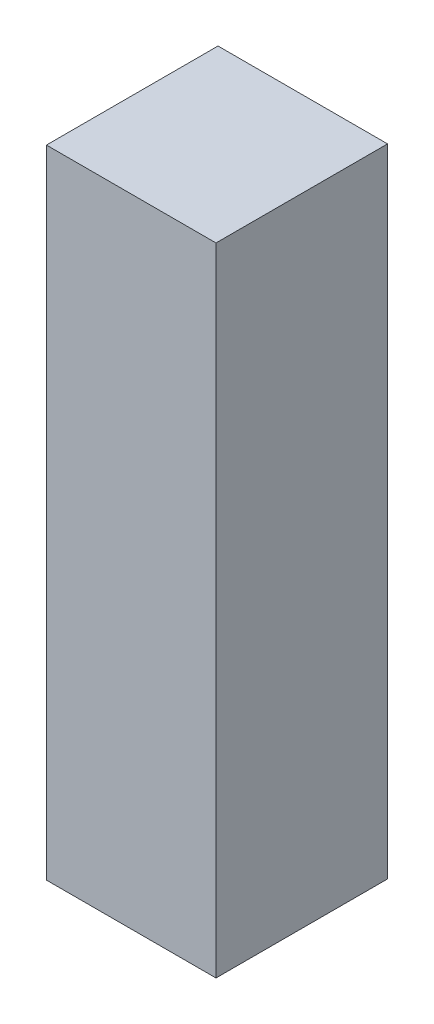
ISO-10303-21;
HEADER;
FILE_DESCRIPTION(('STEP AP214'),'2;1');
FILE_NAME('part.step','',(''),(''),'','','');
FILE_SCHEMA(('AUTOMOTIVE_DESIGN { 1 0 10303 214 1 1 1 1 }'));
ENDSEC;
DATA;
#1=APPLICATION_CONTEXT('core data for automotive mechanical design processes');
#2=APPLICATION_PROTOCOL_DEFINITION('international standard','automotive_design',2000,#1);
#3=PRODUCT_CONTEXT('',#1,'mechanical');
#4=PRODUCT('Part','Part','',(#3));
#5=PRODUCT_RELATED_PRODUCT_CATEGORY('part','',(#4));
#6=PRODUCT_DEFINITION_FORMATION('','',#4);
#7=PRODUCT_DEFINITION_CONTEXT('part definition',#1,'design');
#8=PRODUCT_DEFINITION('design','',#6,#7);
#9=PRODUCT_DEFINITION_SHAPE('','',#8);
#10=(LENGTH_UNIT() NAMED_UNIT(*) SI_UNIT(.MILLI.,.METRE.));
#11=(NAMED_UNIT(*) PLANE_ANGLE_UNIT() SI_UNIT($,.RADIAN.));
#12=(NAMED_UNIT(*) SI_UNIT($,.STERADIAN.) SOLID_ANGLE_UNIT());
#13=UNCERTAINTY_MEASURE_WITH_UNIT(LENGTH_MEASURE(1.E-05),#10,'distance_accuracy_value','');
#14=(GEOMETRIC_REPRESENTATION_CONTEXT(3) GLOBAL_UNCERTAINTY_ASSIGNED_CONTEXT((#13)) GLOBAL_UNIT_ASSIGNED_CONTEXT((#10,
#11,#12)) REPRESENTATION_CONTEXT('',''));
#15=CARTESIAN_POINT('',(0.,0.,0.));
#16=DIRECTION('',(0.,0.,1.));
#17=DIRECTION('',(1.,0.,0.));
#18=AXIS2_PLACEMENT_3D('',#15,#16,#17);
#19=CARTESIAN_POINT('',(10.16,43.556246407511,18.9405834941848));
#20=DIRECTION('',(0.,0.,-1.));
#21=DIRECTION('',(-1.,0.,0.));
#22=AXIS2_PLACEMENT_3D('',#19,#20,#21);
#23=PLANE('',#22);
#24=DIRECTION('',(0.,-1.,0.));
#25=VECTOR('',#24,1.);
#26=CARTESIAN_POINT('',(0.,43.556246407511,18.9405834941848));
#27=LINE('',#26,#25);
#28=CARTESIAN_POINT('',(0.,43.556246407511,18.9405834941848));
#29=VERTEX_POINT('',#28);
#30=CARTESIAN_POINT('',(0.,5.41071383944235,18.9405834941848));
#31=VERTEX_POINT('',#30);
#32=EDGE_CURVE('E95',#29,#31,#27,.T.);
#33=ORIENTED_EDGE('',*,*,#32,.T.);
#34=DIRECTION('',(-1.,0.,0.));
#35=VECTOR('',#34,1.);
#36=CARTESIAN_POINT('',(10.16,5.41071383944235,18.9405834941848));
#37=LINE('',#36,#35);
#38=CARTESIAN_POINT('',(10.16,5.41071383944235,18.9405834941848));
#39=VERTEX_POINT('',#38);
#40=EDGE_CURVE('E11',#39,#31,#37,.T.);
#41=ORIENTED_EDGE('',*,*,#40,.F.);
#42=DIRECTION('',(0.,-1.,0.));
#43=VECTOR('',#42,1.);
#44=CARTESIAN_POINT('',(10.16,43.556246407511,18.9405834941848));
#45=LINE('',#44,#43);
#46=CARTESIAN_POINT('',(10.16,43.556246407511,18.9405834941848));
#47=VERTEX_POINT('',#46);
#48=EDGE_CURVE('E83',#47,#39,#45,.T.);
#49=ORIENTED_EDGE('',*,*,#48,.F.);
#50=DIRECTION('',(-1.,0.,0.));
#51=VECTOR('',#50,1.);
#52=CARTESIAN_POINT('',(10.16,43.556246407511,18.9405834941848));
#53=LINE('',#52,#51);
#54=EDGE_CURVE('E91',#47,#29,#53,.T.);
#55=ORIENTED_EDGE('',*,*,#54,.T.);
#56=EDGE_LOOP('',(#33,#41,#49,#55));
#57=FACE_BOUND('',#56,.T.);
#58=ADVANCED_FACE('F32',(#57),#23,.F.);
#59=CARTESIAN_POINT('',(10.16,5.41071383944235,18.9405834941848));
#60=DIRECTION('',(0.,1.,0.));
#61=DIRECTION('',(0.,0.,1.));
#62=AXIS2_PLACEMENT_3D('',#59,#60,#61);
#63=PLANE('',#62);
#64=DIRECTION('',(0.,0.,-1.));
#65=VECTOR('',#64,1.);
#66=CARTESIAN_POINT('',(0.,5.41071383944235,18.9405834941848));
#67=LINE('',#66,#65);
#68=CARTESIAN_POINT('',(0.,5.41071383944235,8.66022719924431));
#69=VERTEX_POINT('',#68);
#70=EDGE_CURVE('E87',#31,#69,#67,.T.);
#71=ORIENTED_EDGE('',*,*,#70,.T.);
#72=DIRECTION('',(-1.,0.,0.));
#73=VECTOR('',#72,1.);
#74=CARTESIAN_POINT('',(10.16,5.41071383944235,8.66022719924431));
#75=LINE('',#74,#73);
#76=CARTESIAN_POINT('',(10.16,5.41071383944235,8.66022719924431));
#77=VERTEX_POINT('',#76);
#78=EDGE_CURVE('E40',#77,#69,#75,.T.);
#79=ORIENTED_EDGE('',*,*,#78,.F.);
#80=DIRECTION('',(0.,0.,-1.));
#81=VECTOR('',#80,1.);
#82=CARTESIAN_POINT('',(10.16,5.41071383944235,18.9405834941848));
#83=LINE('',#82,#81);
#84=EDGE_CURVE('E78',#39,#77,#83,.T.);
#85=ORIENTED_EDGE('',*,*,#84,.F.);
#86=ORIENTED_EDGE('',*,*,#40,.T.);
#87=EDGE_LOOP('',(#71,#79,#85,#86));
#88=FACE_BOUND('',#87,.T.);
#89=ADVANCED_FACE('F86',(#88),#63,.F.);
#90=CARTESIAN_POINT('',(10.16,43.556246407511,8.66022719924431));
#91=DIRECTION('',(0.,0.,1.));
#92=DIRECTION('',(1.,0.,0.));
#93=AXIS2_PLACEMENT_3D('',#90,#91,#92);
#94=PLANE('',#93);
#95=DIRECTION('',(0.,1.,0.));
#96=VECTOR('',#95,1.);
#97=CARTESIAN_POINT('',(0.,43.556246407511,8.66022719924431));
#98=LINE('',#97,#96);
#99=CARTESIAN_POINT('',(0.,43.556246407511,8.66022719924431));
#100=VERTEX_POINT('',#99);
#101=EDGE_CURVE('E65',#69,#100,#98,.T.);
#102=ORIENTED_EDGE('',*,*,#101,.T.);
#103=DIRECTION('',(-1.,0.,0.));
#104=VECTOR('',#103,1.);
#105=CARTESIAN_POINT('',(10.16,43.556246407511,8.66022719924431));
#106=LINE('',#105,#104);
#107=CARTESIAN_POINT('',(10.16,43.556246407511,8.66022719924431));
#108=VERTEX_POINT('',#107);
#109=EDGE_CURVE('E88',#108,#100,#106,.T.);
#110=ORIENTED_EDGE('',*,*,#109,.F.);
#111=DIRECTION('',(0.,1.,0.));
#112=VECTOR('',#111,1.);
#113=CARTESIAN_POINT('',(10.16,43.556246407511,8.66022719924431));
#114=LINE('',#113,#112);
#115=EDGE_CURVE('E81',#77,#108,#114,.T.);
#116=ORIENTED_EDGE('',*,*,#115,.F.);
#117=ORIENTED_EDGE('',*,*,#78,.T.);
#118=EDGE_LOOP('',(#102,#110,#116,#117));
#119=FACE_BOUND('',#118,.T.);
#120=ADVANCED_FACE('F89',(#119),#94,.F.);
#121=CARTESIAN_POINT('',(10.16,43.556246407511,18.9405834941848));
#122=DIRECTION('',(0.,-1.,0.));
#123=DIRECTION('',(0.,0.,-1.));
#124=AXIS2_PLACEMENT_3D('',#121,#122,#123);
#125=PLANE('',#124);
#126=DIRECTION('',(0.,0.,1.));
#127=VECTOR('',#126,1.);
#128=CARTESIAN_POINT('',(0.,43.556246407511,18.9405834941848));
#129=LINE('',#128,#127);
#130=EDGE_CURVE('E71',#100,#29,#129,.T.);
#131=ORIENTED_EDGE('',*,*,#130,.T.);
#132=ORIENTED_EDGE('',*,*,#54,.F.);
#133=DIRECTION('',(0.,0.,1.));
#134=VECTOR('',#133,1.);
#135=CARTESIAN_POINT('',(10.16,43.556246407511,18.9405834941848));
#136=LINE('',#135,#134);
#137=EDGE_CURVE('E48',#108,#47,#136,.T.);
#138=ORIENTED_EDGE('',*,*,#137,.F.);
#139=ORIENTED_EDGE('',*,*,#109,.T.);
#140=EDGE_LOOP('',(#131,#132,#138,#139));
#141=FACE_BOUND('',#140,.T.);
#142=ADVANCED_FACE('F102',(#141),#125,.F.);
#143=CARTESIAN_POINT('',(10.16,0.,0.));
#144=DIRECTION('',(1.,0.,0.));
#145=DIRECTION('',(0.,0.,-1.));
#146=AXIS2_PLACEMENT_3D('',#143,#144,#145);
#147=PLANE('',#146);
#148=ORIENTED_EDGE('',*,*,#48,.T.);
#149=ORIENTED_EDGE('',*,*,#84,.T.);
#150=ORIENTED_EDGE('',*,*,#115,.T.);
#151=ORIENTED_EDGE('',*,*,#137,.T.);
#152=EDGE_LOOP('',(#148,#149,#150,#151));
#153=FACE_BOUND('',#152,.T.);
#154=ADVANCED_FACE('F79',(#153),#147,.T.);
#155=CARTESIAN_POINT('',(0.,0.,0.));
#156=DIRECTION('',(1.,0.,0.));
#157=DIRECTION('',(0.,0.,-1.));
#158=AXIS2_PLACEMENT_3D('',#155,#156,#157);
#159=PLANE('',#158);
#160=ORIENTED_EDGE('',*,*,#32,.F.);
#161=ORIENTED_EDGE('',*,*,#130,.F.);
#162=ORIENTED_EDGE('',*,*,#101,.F.);
#163=ORIENTED_EDGE('',*,*,#70,.F.);
#164=EDGE_LOOP('',(#160,#161,#162,#163));
#165=FACE_BOUND('',#164,.T.);
#166=ADVANCED_FACE('F105',(#165),#159,.F.);
#167=CLOSED_SHELL('',(#58,#89,#120,#142,#154,#166));
#168=MANIFOLD_SOLID_BREP('B2',#167);
#169=ADVANCED_BREP_SHAPE_REPRESENTATION('',(#18,#168),#14);
#170=SHAPE_DEFINITION_REPRESENTATION(#9,#169);
ENDSEC;
END-ISO-10303-21;
